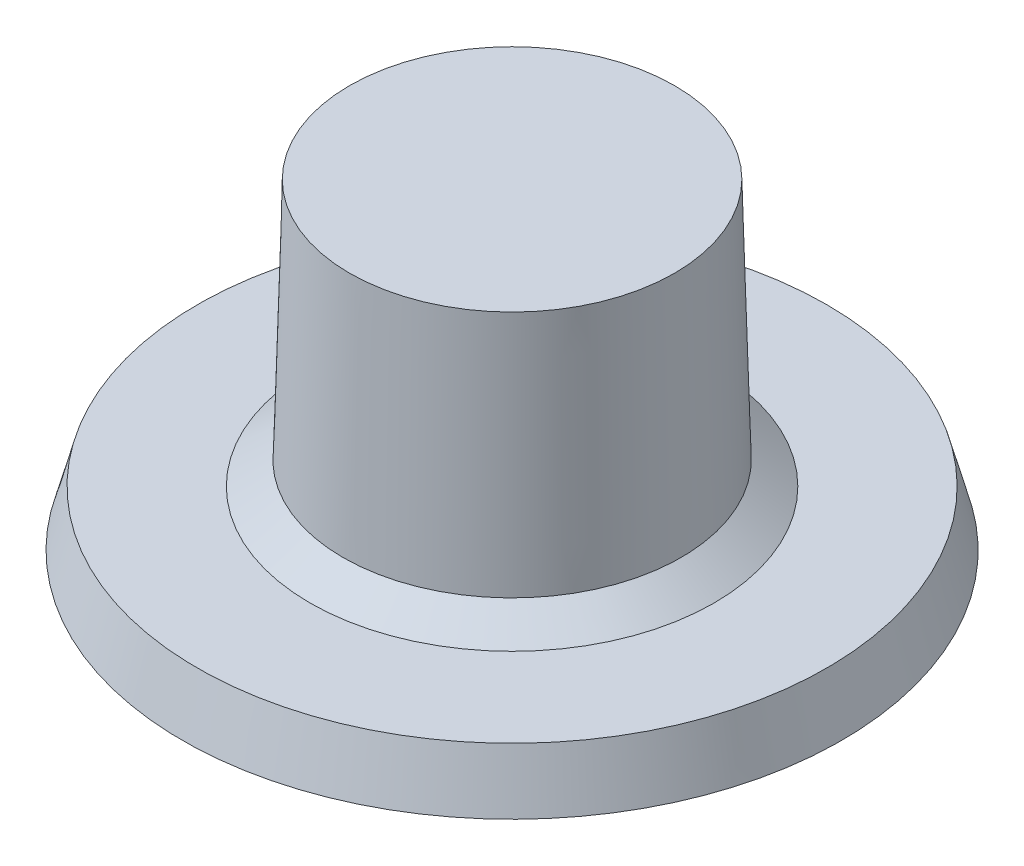
ISO-10303-21;
HEADER;
FILE_DESCRIPTION(('STEP AP214'),'2;1');
FILE_NAME('part.step','',(''),(''),'','','');
FILE_SCHEMA(('AUTOMOTIVE_DESIGN { 1 0 10303 214 1 1 1 1 }'));
ENDSEC;
DATA;
#1=APPLICATION_CONTEXT('core data for automotive mechanical design processes');
#2=APPLICATION_PROTOCOL_DEFINITION('international standard','automotive_design',2000,#1);
#3=PRODUCT_CONTEXT('',#1,'mechanical');
#4=PRODUCT('Part','Part','',(#3));
#5=PRODUCT_RELATED_PRODUCT_CATEGORY('part','',(#4));
#6=PRODUCT_DEFINITION_FORMATION('','',#4);
#7=PRODUCT_DEFINITION_CONTEXT('part definition',#1,'design');
#8=PRODUCT_DEFINITION('design','',#6,#7);
#9=PRODUCT_DEFINITION_SHAPE('','',#8);
#10=(LENGTH_UNIT() NAMED_UNIT(*) SI_UNIT(.MILLI.,.METRE.));
#11=(NAMED_UNIT(*) PLANE_ANGLE_UNIT() SI_UNIT($,.RADIAN.));
#12=(NAMED_UNIT(*) SI_UNIT($,.STERADIAN.) SOLID_ANGLE_UNIT());
#13=UNCERTAINTY_MEASURE_WITH_UNIT(LENGTH_MEASURE(1.E-05),#10,'distance_accuracy_value','');
#14=(GEOMETRIC_REPRESENTATION_CONTEXT(3) GLOBAL_UNCERTAINTY_ASSIGNED_CONTEXT((#13)) GLOBAL_UNIT_ASSIGNED_CONTEXT((#10,
#11,#12)) REPRESENTATION_CONTEXT('',''));
#15=CARTESIAN_POINT('',(0.,0.,0.));
#16=DIRECTION('',(0.,0.,1.));
#17=DIRECTION('',(1.,0.,0.));
#18=AXIS2_PLACEMENT_3D('',#15,#16,#17);
#19=CARTESIAN_POINT('',(0.,0.,0.));
#20=DIRECTION('',(0.,-1.,0.));
#21=DIRECTION('',(0.,0.,-1.));
#22=AXIS2_PLACEMENT_3D('',#19,#20,#21);
#23=PLANE('',#22);
#24=CARTESIAN_POINT('',(0.,0.,0.));
#25=DIRECTION('',(0.,-1.,0.));
#26=DIRECTION('',(0.,0.,-1.));
#27=AXIS2_PLACEMENT_3D('',#24,#25,#26);
#28=CIRCLE('',#27,82.77987);
#29=CARTESIAN_POINT('',(0.,0.,-82.77987));
#30=VERTEX_POINT('',#29);
#31=EDGE_CURVE('E56',#30,#30,#28,.T.);
#32=ORIENTED_EDGE('',*,*,#31,.T.);
#33=EDGE_LOOP('',(#32));
#34=FACE_BOUND('',#33,.T.);
#35=ADVANCED_FACE('F32',(#34),#23,.T.);
#36=CARTESIAN_POINT('',(0.,0.,0.));
#37=DIRECTION('',(0.,-1.,0.));
#38=DIRECTION('',(0.,0.,-1.));
#39=AXIS2_PLACEMENT_3D('',#36,#37,#38);
#40=CONICAL_SURFACE('',#39,82.77987,0.262304128585208);
#41=CARTESIAN_POINT('',(0.,13.891514,0.));
#42=DIRECTION('',(0.,-1.,0.));
#43=DIRECTION('',(0.,0.,-1.));
#44=AXIS2_PLACEMENT_3D('',#41,#42,#43);
#45=CIRCLE('',#44,79.050134);
#46=CARTESIAN_POINT('',(0.,13.891514,-79.050134));
#47=VERTEX_POINT('',#46);
#48=EDGE_CURVE('E59',#47,#47,#45,.T.);
#49=ORIENTED_EDGE('',*,*,#48,.T.);
#50=EDGE_LOOP('',(#49));
#51=FACE_BOUND('',#50,.T.);
#52=ORIENTED_EDGE('',*,*,#31,.F.);
#53=EDGE_LOOP('',(#52));
#54=FACE_BOUND('',#53,.T.);
#55=ADVANCED_FACE('F85',(#51,#54),#40,.T.);
#56=CARTESIAN_POINT('',(0.,13.891514,79.050134));
#57=DIRECTION('',(0.,1.,0.));
#58=DIRECTION('',(0.,0.,1.));
#59=AXIS2_PLACEMENT_3D('',#56,#57,#58);
#60=PLANE('',#59);
#61=CARTESIAN_POINT('',(0.,13.891514,0.));
#62=DIRECTION('',(0.,-1.,0.));
#63=DIRECTION('',(0.,0.,-1.));
#64=AXIS2_PLACEMENT_3D('',#61,#62,#63);
#65=CIRCLE('',#64,50.756312);
#66=CARTESIAN_POINT('',(0.,13.891514,-50.756312));
#67=VERTEX_POINT('',#66);
#68=EDGE_CURVE('E62',#67,#67,#65,.T.);
#69=ORIENTED_EDGE('',*,*,#68,.T.);
#70=EDGE_LOOP('',(#69));
#71=FACE_BOUND('',#70,.T.);
#72=ORIENTED_EDGE('',*,*,#48,.F.);
#73=EDGE_LOOP('',(#72));
#74=FACE_BOUND('',#73,.T.);
#75=ADVANCED_FACE('F91',(#71,#74),#60,.T.);
#76=CARTESIAN_POINT('',(0.,13.891514,0.));
#77=DIRECTION('',(0.,-1.,0.));
#78=DIRECTION('',(0.,0.,-1.));
#79=AXIS2_PLACEMENT_3D('',#76,#77,#78);
#80=CONICAL_SURFACE('',#79,50.756312,0.961017769651953);
#81=CARTESIAN_POINT('',(0.,19.664934,0.));
#82=DIRECTION('',(0.,-1.,0.));
#83=DIRECTION('',(0.,0.,-1.));
#84=AXIS2_PLACEMENT_3D('',#81,#82,#83);
#85=CIRCLE('',#84,42.491914);
#86=CARTESIAN_POINT('',(0.,19.664934,-42.491914));
#87=VERTEX_POINT('',#86);
#88=EDGE_CURVE('E65',#87,#87,#85,.T.);
#89=ORIENTED_EDGE('',*,*,#88,.T.);
#90=EDGE_LOOP('',(#89));
#91=FACE_BOUND('',#90,.T.);
#92=ORIENTED_EDGE('',*,*,#68,.F.);
#93=EDGE_LOOP('',(#92));
#94=FACE_BOUND('',#93,.T.);
#95=ADVANCED_FACE('F82',(#91,#94),#80,.T.);
#96=CARTESIAN_POINT('',(0.,19.664934,0.));
#97=DIRECTION('',(0.,-1.,0.));
#98=DIRECTION('',(0.,0.,-1.));
#99=AXIS2_PLACEMENT_3D('',#96,#97,#98);
#100=CONICAL_SURFACE('',#99,42.491914,0.0274149764392239);
#101=CARTESIAN_POINT('',(0.,80.659732,0.));
#102=DIRECTION('',(0.,-1.,0.));
#103=DIRECTION('',(0.,0.,-1.));
#104=AXIS2_PLACEMENT_3D('',#101,#102,#103);
#105=CIRCLE('',#104,40.819324);
#106=CARTESIAN_POINT('',(0.,80.659732,-40.819324));
#107=VERTEX_POINT('',#106);
#108=EDGE_CURVE('E68',#107,#107,#105,.T.);
#109=ORIENTED_EDGE('',*,*,#108,.T.);
#110=EDGE_LOOP('',(#109));
#111=FACE_BOUND('',#110,.T.);
#112=ORIENTED_EDGE('',*,*,#88,.F.);
#113=EDGE_LOOP('',(#112));
#114=FACE_BOUND('',#113,.T.);
#115=ADVANCED_FACE('F72',(#111,#114),#100,.T.);
#116=CARTESIAN_POINT('',(0.,80.659732,40.819324));
#117=DIRECTION('',(0.,1.,0.));
#118=DIRECTION('',(0.,0.,1.));
#119=AXIS2_PLACEMENT_3D('',#116,#117,#118);
#120=PLANE('',#119);
#121=ORIENTED_EDGE('',*,*,#108,.F.);
#122=EDGE_LOOP('',(#121));
#123=FACE_BOUND('',#122,.T.);
#124=ADVANCED_FACE('F75',(#123),#120,.T.);
#125=CLOSED_SHELL('',(#35,#55,#75,#95,#115,#124));
#126=CARTESIAN_POINT('',(0.,78.119732,40.819324));
#127=DIRECTION('',(0.,1.,0.));
#128=DIRECTION('',(0.,0.,1.));
#129=AXIS2_PLACEMENT_3D('',#126,#127,#128);
#130=PLANE('',#129);
#131=CARTESIAN_POINT('',(0.,78.119732,0.));
#132=DIRECTION('',(0.,-1.,0.));
#133=DIRECTION('',(0.,0.,-1.));
#134=AXIS2_PLACEMENT_3D('',#131,#132,#133);
#135=CIRCLE('',#134,38.3480206838185);
#136=CARTESIAN_POINT('',(0.,78.119732,-38.3480206838185));
#137=VERTEX_POINT('',#136);
#138=EDGE_CURVE('E10',#137,#137,#135,.T.);
#139=ORIENTED_EDGE('',*,*,#138,.T.);
#140=EDGE_LOOP('',(#139));
#141=FACE_BOUND('',#140,.T.);
#142=ADVANCED_FACE('F34',(#141),#130,.F.);
#143=CARTESIAN_POINT('',(0.,18.3157605509726,0.));
#144=DIRECTION('',(0.,-1.,0.));
#145=DIRECTION('',(0.,0.,-1.));
#146=AXIS2_PLACEMENT_3D('',#143,#144,#145);
#147=CONICAL_SURFACE('',#146,39.9879560206964,0.0274149764392238);
#148=ORIENTED_EDGE('',*,*,#138,.F.);
#149=EDGE_LOOP('',(#148));
#150=FACE_BOUND('',#149,.T.);
#151=CARTESIAN_POINT('',(0.,18.3157605509726,0.));
#152=DIRECTION('',(0.,-1.,0.));
#153=DIRECTION('',(0.,0.,-1.));
#154=AXIS2_PLACEMENT_3D('',#151,#152,#153);
#155=CIRCLE('',#154,39.9879560206964);
#156=CARTESIAN_POINT('',(0.,18.3157605509726,-39.9879560206964));
#157=VERTEX_POINT('',#156);
#158=EDGE_CURVE('E40',#157,#157,#155,.T.);
#159=ORIENTED_EDGE('',*,*,#158,.T.);
#160=EDGE_LOOP('',(#159));
#161=FACE_BOUND('',#160,.T.);
#162=ADVANCED_FACE('F111',(#150,#161),#147,.F.);
#163=CARTESIAN_POINT('',(0.,11.351514,0.));
#164=DIRECTION('',(0.,-1.,0.));
#165=DIRECTION('',(0.,0.,-1.));
#166=AXIS2_PLACEMENT_3D('',#163,#164,#165);
#167=CONICAL_SURFACE('',#166,49.9569701002826,0.961017769651952);
#168=ORIENTED_EDGE('',*,*,#158,.F.);
#169=EDGE_LOOP('',(#168));
#170=FACE_BOUND('',#169,.T.);
#171=CARTESIAN_POINT('',(0.,11.351514,0.));
#172=DIRECTION('',(0.,-1.,0.));
#173=DIRECTION('',(0.,0.,-1.));
#174=AXIS2_PLACEMENT_3D('',#171,#172,#173);
#175=CIRCLE('',#174,49.9569701002826);
#176=CARTESIAN_POINT('',(0.,11.351514,-49.9569701002826));
#177=VERTEX_POINT('',#176);
#178=EDGE_CURVE('E44',#177,#177,#175,.T.);
#179=ORIENTED_EDGE('',*,*,#178,.T.);
#180=EDGE_LOOP('',(#179));
#181=FACE_BOUND('',#180,.T.);
#182=ADVANCED_FACE('F108',(#170,#181),#167,.F.);
#183=CARTESIAN_POINT('',(0.,11.351514,79.050134));
#184=DIRECTION('',(0.,1.,0.));
#185=DIRECTION('',(0.,0.,1.));
#186=AXIS2_PLACEMENT_3D('',#183,#184,#185);
#187=PLANE('',#186);
#188=ORIENTED_EDGE('',*,*,#178,.F.);
#189=EDGE_LOOP('',(#188));
#190=FACE_BOUND('',#189,.T.);
#191=CARTESIAN_POINT('',(0.,11.351514,0.));
#192=DIRECTION('',(0.,-1.,0.));
#193=DIRECTION('',(0.,0.,-1.));
#194=AXIS2_PLACEMENT_3D('',#191,#192,#193);
#195=CIRCLE('',#194,77.1021417012572);
#196=CARTESIAN_POINT('',(0.,11.351514,-77.1021417012572));
#197=VERTEX_POINT('',#196);
#198=EDGE_CURVE('E48',#197,#197,#195,.T.);
#199=ORIENTED_EDGE('',*,*,#198,.T.);
#200=EDGE_LOOP('',(#199));
#201=FACE_BOUND('',#200,.T.);
#202=ADVANCED_FACE('F104',(#190,#201),#187,.F.);
#203=CARTESIAN_POINT('',(0.,2.54,0.));
#204=DIRECTION('',(0.,-1.,0.));
#205=DIRECTION('',(0.,0.,-1.));
#206=AXIS2_PLACEMENT_3D('',#203,#204,#205);
#207=CONICAL_SURFACE('',#206,79.4679472556628,0.262304128585208);
#208=ORIENTED_EDGE('',*,*,#198,.F.);
#209=EDGE_LOOP('',(#208));
#210=FACE_BOUND('',#209,.T.);
#211=CARTESIAN_POINT('',(0.,2.54,0.));
#212=DIRECTION('',(0.,-1.,0.));
#213=DIRECTION('',(0.,0.,-1.));
#214=AXIS2_PLACEMENT_3D('',#211,#212,#213);
#215=CIRCLE('',#214,79.4679472556628);
#216=CARTESIAN_POINT('',(0.,2.54,-79.4679472556628));
#217=VERTEX_POINT('',#216);
#218=EDGE_CURVE('E53',#217,#217,#215,.T.);
#219=ORIENTED_EDGE('',*,*,#218,.T.);
#220=EDGE_LOOP('',(#219));
#221=FACE_BOUND('',#220,.T.);
#222=ADVANCED_FACE('F99',(#210,#221),#207,.F.);
#223=CARTESIAN_POINT('',(0.,2.54,0.));
#224=DIRECTION('',(0.,-1.,0.));
#225=DIRECTION('',(0.,0.,-1.));
#226=AXIS2_PLACEMENT_3D('',#223,#224,#225);
#227=PLANE('',#226);
#228=ORIENTED_EDGE('',*,*,#218,.F.);
#229=EDGE_LOOP('',(#228));
#230=FACE_BOUND('',#229,.T.);
#231=ADVANCED_FACE('F96',(#230),#227,.F.);
#232=CLOSED_SHELL('',(#142,#162,#182,#202,#222,#231));
#233=ORIENTED_CLOSED_SHELL('',*,#232,.T.);
#234=BREP_WITH_VOIDS('B2',#125,(#233));
#235=ADVANCED_BREP_SHAPE_REPRESENTATION('',(#18,#234),#14);
#236=SHAPE_DEFINITION_REPRESENTATION(#9,#235);
ENDSEC;
END-ISO-10303-21;
